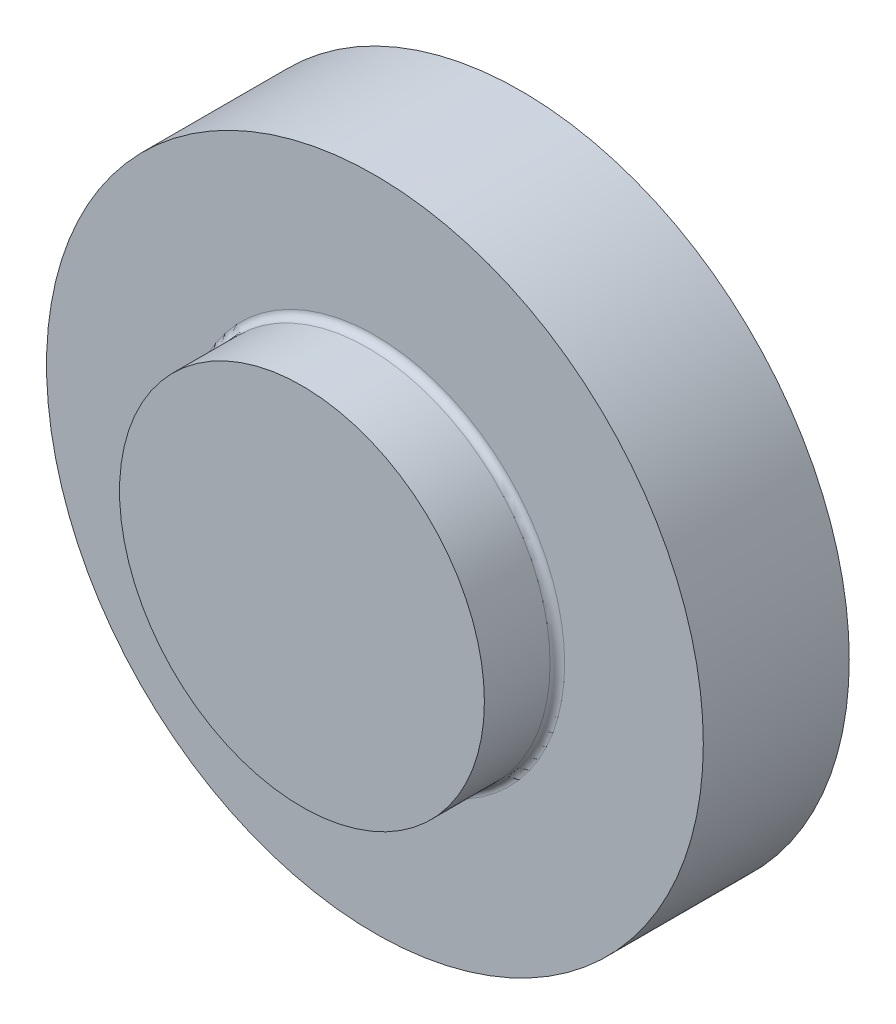
ISO-10303-21;
HEADER;
FILE_DESCRIPTION(('STEP AP214'),'2;1');
FILE_NAME('part.step','',(''),(''),'','','');
FILE_SCHEMA(('AUTOMOTIVE_DESIGN { 1 0 10303 214 1 1 1 1 }'));
ENDSEC;
DATA;
#1=APPLICATION_CONTEXT('core data for automotive mechanical design processes');
#2=APPLICATION_PROTOCOL_DEFINITION('international standard','automotive_design',2000,#1);
#3=PRODUCT_CONTEXT('',#1,'mechanical');
#4=PRODUCT('Part','Part','',(#3));
#5=PRODUCT_RELATED_PRODUCT_CATEGORY('part','',(#4));
#6=PRODUCT_DEFINITION_FORMATION('','',#4);
#7=PRODUCT_DEFINITION_CONTEXT('part definition',#1,'design');
#8=PRODUCT_DEFINITION('design','',#6,#7);
#9=PRODUCT_DEFINITION_SHAPE('','',#8);
#10=(LENGTH_UNIT() NAMED_UNIT(*) SI_UNIT(.MILLI.,.METRE.));
#11=(NAMED_UNIT(*) PLANE_ANGLE_UNIT() SI_UNIT($,.RADIAN.));
#12=(NAMED_UNIT(*) SI_UNIT($,.STERADIAN.) SOLID_ANGLE_UNIT());
#13=UNCERTAINTY_MEASURE_WITH_UNIT(LENGTH_MEASURE(1.E-05),#10,'distance_accuracy_value','');
#14=(GEOMETRIC_REPRESENTATION_CONTEXT(3) GLOBAL_UNCERTAINTY_ASSIGNED_CONTEXT((#13)) GLOBAL_UNIT_ASSIGNED_CONTEXT((#10,
#11,#12)) REPRESENTATION_CONTEXT('',''));
#15=CARTESIAN_POINT('',(0.,0.,0.));
#16=DIRECTION('',(0.,0.,1.));
#17=DIRECTION('',(1.,0.,0.));
#18=AXIS2_PLACEMENT_3D('',#15,#16,#17);
#19=CARTESIAN_POINT('',(0.,0.,40.));
#20=DIRECTION('',(0.,0.,-1.));
#21=DIRECTION('',(-1.,0.,0.));
#22=AXIS2_PLACEMENT_3D('',#19,#20,#21);
#23=CYLINDRICAL_SURFACE('',#22,90.);
#24=CARTESIAN_POINT('',(0.,0.,40.));
#25=DIRECTION('',(0.,0.,1.));
#26=DIRECTION('',(1.,0.,0.));
#27=AXIS2_PLACEMENT_3D('',#24,#25,#26);
#28=CIRCLE('',#27,90.);
#29=CARTESIAN_POINT('',(90.,0.,40.));
#30=VERTEX_POINT('',#29);
#31=EDGE_CURVE('E48',#30,#30,#28,.T.);
#32=ORIENTED_EDGE('',*,*,#31,.F.);
#33=EDGE_LOOP('',(#32));
#34=FACE_BOUND('',#33,.T.);
#35=CARTESIAN_POINT('',(0.,0.,0.));
#36=DIRECTION('',(0.,0.,1.));
#37=DIRECTION('',(1.,0.,0.));
#38=AXIS2_PLACEMENT_3D('',#35,#36,#37);
#39=CIRCLE('',#38,90.);
#40=CARTESIAN_POINT('',(90.,0.,0.));
#41=VERTEX_POINT('',#40);
#42=EDGE_CURVE('E55',#41,#41,#39,.T.);
#43=ORIENTED_EDGE('',*,*,#42,.T.);
#44=EDGE_LOOP('',(#43));
#45=FACE_BOUND('',#44,.T.);
#46=ADVANCED_FACE('F40',(#34,#45),#23,.T.);
#47=CARTESIAN_POINT('',(0.,0.,40.));
#48=DIRECTION('',(0.,0.,1.));
#49=DIRECTION('',(1.,0.,0.));
#50=AXIS2_PLACEMENT_3D('',#47,#48,#49);
#51=PLANE('',#50);
#52=CARTESIAN_POINT('',(0.,0.,40.));
#53=DIRECTION('',(0.,0.,1.));
#54=DIRECTION('',(1.,0.,0.));
#55=AXIS2_PLACEMENT_3D('',#52,#53,#54);
#56=CIRCLE('',#55,52.);
#57=CARTESIAN_POINT('',(52.,0.,40.));
#58=VERTEX_POINT('',#57);
#59=EDGE_CURVE('E10',#58,#58,#56,.F.);
#60=ORIENTED_EDGE('',*,*,#59,.T.);
#61=EDGE_LOOP('',(#60));
#62=FACE_BOUND('',#61,.T.);
#63=ORIENTED_EDGE('',*,*,#31,.T.);
#64=EDGE_LOOP('',(#63));
#65=FACE_BOUND('',#64,.T.);
#66=ADVANCED_FACE('F74',(#62,#65),#51,.T.);
#67=CARTESIAN_POINT('',(0.,0.,0.));
#68=DIRECTION('',(0.,0.,1.));
#69=DIRECTION('',(1.,0.,0.));
#70=AXIS2_PLACEMENT_3D('',#67,#68,#69);
#71=PLANE('',#70);
#72=ORIENTED_EDGE('',*,*,#42,.F.);
#73=EDGE_LOOP('',(#72));
#74=FACE_BOUND('',#73,.T.);
#75=ADVANCED_FACE('F61',(#74),#71,.F.);
#76=CARTESIAN_POINT('',(0.,0.,60.));
#77=DIRECTION('',(0.,0.,-1.));
#78=DIRECTION('',(-1.,0.,0.));
#79=AXIS2_PLACEMENT_3D('',#76,#77,#78);
#80=CYLINDRICAL_SURFACE('',#79,50.);
#81=CARTESIAN_POINT('',(0.,0.,42.));
#82=DIRECTION('',(0.,0.,1.));
#83=DIRECTION('',(1.,0.,0.));
#84=AXIS2_PLACEMENT_3D('',#81,#82,#83);
#85=CIRCLE('',#84,50.);
#86=CARTESIAN_POINT('',(50.,0.,42.));
#87=VERTEX_POINT('',#86);
#88=EDGE_CURVE('E42',#87,#87,#85,.T.);
#89=ORIENTED_EDGE('',*,*,#88,.T.);
#90=EDGE_LOOP('',(#89));
#91=FACE_BOUND('',#90,.T.);
#92=CARTESIAN_POINT('',(0.,0.,60.));
#93=DIRECTION('',(0.,0.,1.));
#94=DIRECTION('',(1.,0.,0.));
#95=AXIS2_PLACEMENT_3D('',#92,#93,#94);
#96=CIRCLE('',#95,50.);
#97=CARTESIAN_POINT('',(50.,0.,60.));
#98=VERTEX_POINT('',#97);
#99=EDGE_CURVE('E57',#98,#98,#96,.T.);
#100=ORIENTED_EDGE('',*,*,#99,.F.);
#101=EDGE_LOOP('',(#100));
#102=FACE_BOUND('',#101,.T.);
#103=ADVANCED_FACE('F62',(#91,#102),#80,.T.);
#104=CARTESIAN_POINT('',(0.,0.,60.));
#105=DIRECTION('',(0.,0.,1.));
#106=DIRECTION('',(1.,0.,0.));
#107=AXIS2_PLACEMENT_3D('',#104,#105,#106);
#108=PLANE('',#107);
#109=ORIENTED_EDGE('',*,*,#99,.T.);
#110=EDGE_LOOP('',(#109));
#111=FACE_BOUND('',#110,.T.);
#112=ADVANCED_FACE('F63',(#111),#108,.T.);
#113=CARTESIAN_POINT('',(0.,0.,42.));
#114=DIRECTION('',(0.,0.,1.));
#115=DIRECTION('',(1.,0.,0.));
#116=AXIS2_PLACEMENT_3D('',#113,#114,#115);
#117=TOROIDAL_SURFACE('',#116,52.,2.);
#118=ORIENTED_EDGE('',*,*,#59,.F.);
#119=EDGE_LOOP('',(#118));
#120=FACE_BOUND('',#119,.T.);
#121=ORIENTED_EDGE('',*,*,#88,.F.);
#122=EDGE_LOOP('',(#121));
#123=FACE_BOUND('',#122,.T.);
#124=ADVANCED_FACE('F39',(#120,#123),#117,.F.);
#125=CLOSED_SHELL('',(#46,#66,#75,#103,#112,#124));
#126=MANIFOLD_SOLID_BREP('B2',#125);
#127=ADVANCED_BREP_SHAPE_REPRESENTATION('',(#18,#126),#14);
#128=SHAPE_DEFINITION_REPRESENTATION(#9,#127);
ENDSEC;
END-ISO-10303-21;
